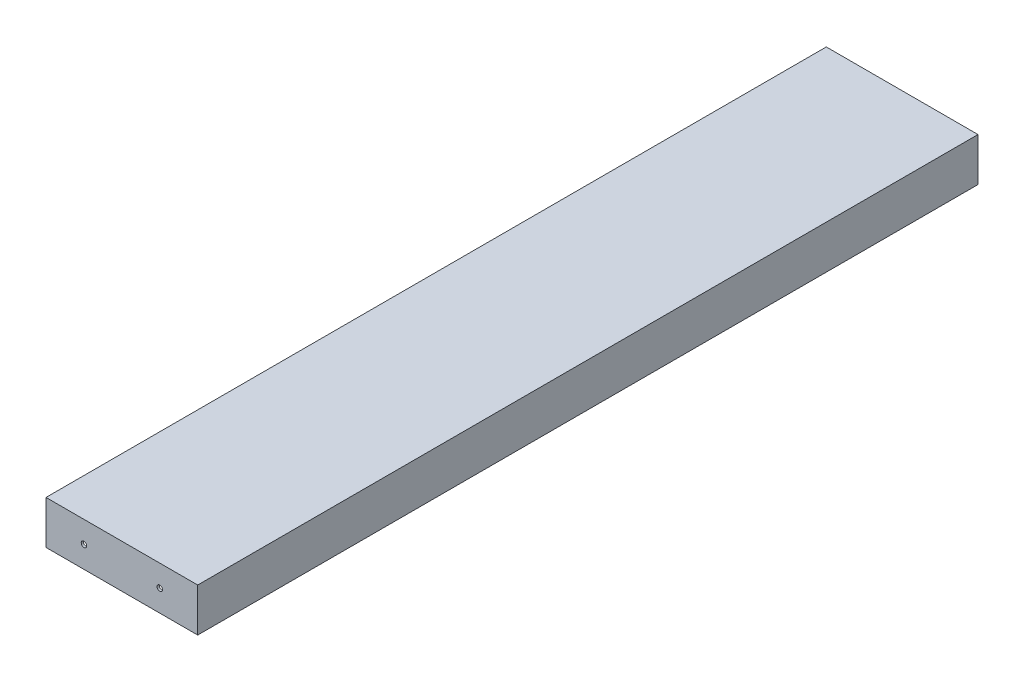
ISO-10303-21;
HEADER;
FILE_DESCRIPTION(('STEP AP214'),'2;1');
FILE_NAME('part.step','',(''),(''),'','','');
FILE_SCHEMA(('AUTOMOTIVE_DESIGN { 1 0 10303 214 1 1 1 1 }'));
ENDSEC;
DATA;
#1=APPLICATION_CONTEXT('core data for automotive mechanical design processes');
#2=APPLICATION_PROTOCOL_DEFINITION('international standard','automotive_design',2000,#1);
#3=PRODUCT_CONTEXT('',#1,'mechanical');
#4=PRODUCT('Part','Part','',(#3));
#5=PRODUCT_RELATED_PRODUCT_CATEGORY('part','',(#4));
#6=PRODUCT_DEFINITION_FORMATION('','',#4);
#7=PRODUCT_DEFINITION_CONTEXT('part definition',#1,'design');
#8=PRODUCT_DEFINITION('design','',#6,#7);
#9=PRODUCT_DEFINITION_SHAPE('','',#8);
#10=(LENGTH_UNIT() NAMED_UNIT(*) SI_UNIT(.MILLI.,.METRE.));
#11=(NAMED_UNIT(*) PLANE_ANGLE_UNIT() SI_UNIT($,.RADIAN.));
#12=(NAMED_UNIT(*) SI_UNIT($,.STERADIAN.) SOLID_ANGLE_UNIT());
#13=UNCERTAINTY_MEASURE_WITH_UNIT(LENGTH_MEASURE(1.E-05),#10,'distance_accuracy_value','');
#14=(GEOMETRIC_REPRESENTATION_CONTEXT(3) GLOBAL_UNCERTAINTY_ASSIGNED_CONTEXT((#13)) GLOBAL_UNIT_ASSIGNED_CONTEXT((#10,
#11,#12)) REPRESENTATION_CONTEXT('',''));
#15=CARTESIAN_POINT('',(0.,0.,0.));
#16=DIRECTION('',(0.,0.,1.));
#17=DIRECTION('',(1.,0.,0.));
#18=AXIS2_PLACEMENT_3D('',#15,#16,#17);
#19=CARTESIAN_POINT('',(0.,0.,914.4));
#20=DIRECTION('',(0.,0.,-1.));
#21=DIRECTION('',(-1.,0.,0.));
#22=AXIS2_PLACEMENT_3D('',#19,#20,#21);
#23=PLANE('',#22);
#24=CARTESIAN_POINT('',(133.35,25.4,914.4));
#25=DIRECTION('',(0.,0.,-1.));
#26=DIRECTION('',(-1.,0.,0.));
#27=AXIS2_PLACEMENT_3D('',#24,#25,#26);
#28=CIRCLE('',#27,3.175);
#29=CARTESIAN_POINT('',(130.175,25.4,914.4));
#30=VERTEX_POINT('',#29);
#31=EDGE_CURVE('E220',#30,#30,#28,.T.);
#32=ORIENTED_EDGE('',*,*,#31,.T.);
#33=EDGE_LOOP('',(#32));
#34=FACE_BOUND('',#33,.T.);
#35=DIRECTION('',(0.,-1.,0.));
#36=VECTOR('',#35,1.);
#37=CARTESIAN_POINT('',(0.,0.,914.4));
#38=LINE('',#37,#36);
#39=CARTESIAN_POINT('',(0.,50.8,914.4));
#40=VERTEX_POINT('',#39);
#41=CARTESIAN_POINT('',(0.,0.,914.4));
#42=VERTEX_POINT('',#41);
#43=EDGE_CURVE('E181',#40,#42,#38,.T.);
#44=ORIENTED_EDGE('',*,*,#43,.T.);
#45=DIRECTION('',(1.,0.,0.));
#46=VECTOR('',#45,1.);
#47=CARTESIAN_POINT('',(0.,0.,914.4));
#48=LINE('',#47,#46);
#49=CARTESIAN_POINT('',(177.8,0.,914.4));
#50=VERTEX_POINT('',#49);
#51=EDGE_CURVE('E100',#42,#50,#48,.T.);
#52=ORIENTED_EDGE('',*,*,#51,.T.);
#53=DIRECTION('',(0.,1.,0.));
#54=VECTOR('',#53,1.);
#55=CARTESIAN_POINT('',(177.8,0.,914.4));
#56=LINE('',#55,#54);
#57=CARTESIAN_POINT('',(177.8,50.8,914.4));
#58=VERTEX_POINT('',#57);
#59=EDGE_CURVE('E186',#50,#58,#56,.T.);
#60=ORIENTED_EDGE('',*,*,#59,.T.);
#61=DIRECTION('',(-1.,0.,0.));
#62=VECTOR('',#61,1.);
#63=CARTESIAN_POINT('',(0.,50.8,914.4));
#64=LINE('',#63,#62);
#65=EDGE_CURVE('E72',#58,#40,#64,.T.);
#66=ORIENTED_EDGE('',*,*,#65,.T.);
#67=EDGE_LOOP('',(#44,#52,#60,#66));
#68=FACE_BOUND('',#67,.T.);
#69=CARTESIAN_POINT('',(44.45,25.4,914.4));
#70=DIRECTION('',(0.,0.,-1.));
#71=DIRECTION('',(-1.,0.,0.));
#72=AXIS2_PLACEMENT_3D('',#69,#70,#71);
#73=CIRCLE('',#72,3.175);
#74=CARTESIAN_POINT('',(41.275,25.4,914.4));
#75=VERTEX_POINT('',#74);
#76=EDGE_CURVE('E149',#75,#75,#73,.F.);
#77=ORIENTED_EDGE('',*,*,#76,.F.);
#78=EDGE_LOOP('',(#77));
#79=FACE_BOUND('',#78,.T.);
#80=ADVANCED_FACE('F45',(#34,#68,#79),#23,.F.);
#81=CARTESIAN_POINT('',(0.,0.,0.));
#82=DIRECTION('',(0.,0.,-1.));
#83=DIRECTION('',(-1.,0.,0.));
#84=AXIS2_PLACEMENT_3D('',#81,#82,#83);
#85=PLANE('',#84);
#86=DIRECTION('',(0.,-1.,0.));
#87=VECTOR('',#86,1.);
#88=CARTESIAN_POINT('',(0.,0.,0.));
#89=LINE('',#88,#87);
#90=CARTESIAN_POINT('',(0.,50.8,0.));
#91=VERTEX_POINT('',#90);
#92=CARTESIAN_POINT('',(0.,0.,0.));
#93=VERTEX_POINT('',#92);
#94=EDGE_CURVE('E173',#91,#93,#89,.T.);
#95=ORIENTED_EDGE('',*,*,#94,.F.);
#96=DIRECTION('',(-1.,0.,0.));
#97=VECTOR('',#96,1.);
#98=CARTESIAN_POINT('',(0.,50.8,0.));
#99=LINE('',#98,#97);
#100=CARTESIAN_POINT('',(177.8,50.8,0.));
#101=VERTEX_POINT('',#100);
#102=EDGE_CURVE('E93',#101,#91,#99,.T.);
#103=ORIENTED_EDGE('',*,*,#102,.F.);
#104=DIRECTION('',(0.,1.,0.));
#105=VECTOR('',#104,1.);
#106=CARTESIAN_POINT('',(177.8,0.,0.));
#107=LINE('',#106,#105);
#108=CARTESIAN_POINT('',(177.8,0.,0.));
#109=VERTEX_POINT('',#108);
#110=EDGE_CURVE('E198',#109,#101,#107,.T.);
#111=ORIENTED_EDGE('',*,*,#110,.F.);
#112=DIRECTION('',(1.,0.,0.));
#113=VECTOR('',#112,1.);
#114=CARTESIAN_POINT('',(0.,0.,0.));
#115=LINE('',#114,#113);
#116=EDGE_CURVE('E195',#93,#109,#115,.T.);
#117=ORIENTED_EDGE('',*,*,#116,.F.);
#118=EDGE_LOOP('',(#95,#103,#111,#117));
#119=FACE_BOUND('',#118,.T.);
#120=CARTESIAN_POINT('',(133.35,25.4,0.));
#121=DIRECTION('',(0.,0.,-1.));
#122=DIRECTION('',(-1.,0.,0.));
#123=AXIS2_PLACEMENT_3D('',#120,#121,#122);
#124=CIRCLE('',#123,3.175);
#125=CARTESIAN_POINT('',(130.175,25.4,0.));
#126=VERTEX_POINT('',#125);
#127=EDGE_CURVE('E223',#126,#126,#124,.T.);
#128=ORIENTED_EDGE('',*,*,#127,.F.);
#129=EDGE_LOOP('',(#128));
#130=FACE_BOUND('',#129,.T.);
#131=CARTESIAN_POINT('',(44.45,25.4,0.));
#132=DIRECTION('',(0.,0.,-1.));
#133=DIRECTION('',(-1.,0.,0.));
#134=AXIS2_PLACEMENT_3D('',#131,#132,#133);
#135=CIRCLE('',#134,3.175);
#136=CARTESIAN_POINT('',(41.275,25.4,0.));
#137=VERTEX_POINT('',#136);
#138=EDGE_CURVE('E214',#137,#137,#135,.F.);
#139=ORIENTED_EDGE('',*,*,#138,.T.);
#140=EDGE_LOOP('',(#139));
#141=FACE_BOUND('',#140,.T.);
#142=ADVANCED_FACE('F251',(#119,#130,#141),#85,.T.);
#143=CARTESIAN_POINT('',(0.,0.,911.86));
#144=DIRECTION('',(0.,0.,-1.));
#145=DIRECTION('',(-1.,0.,0.));
#146=AXIS2_PLACEMENT_3D('',#143,#144,#145);
#147=PLANE('',#146);
#148=DIRECTION('',(0.,-1.,0.));
#149=VECTOR('',#148,1.);
#150=CARTESIAN_POINT('',(2.54,0.,911.86));
#151=LINE('',#150,#149);
#152=CARTESIAN_POINT('',(2.54,48.26,911.86));
#153=VERTEX_POINT('',#152);
#154=CARTESIAN_POINT('',(2.54,0.,911.86));
#155=VERTEX_POINT('',#154);
#156=EDGE_CURVE('E63',#153,#155,#151,.T.);
#157=ORIENTED_EDGE('',*,*,#156,.F.);
#158=DIRECTION('',(-1.,0.,0.));
#159=VECTOR('',#158,1.);
#160=CARTESIAN_POINT('',(0.,48.26,911.86));
#161=LINE('',#160,#159);
#162=CARTESIAN_POINT('',(175.26,48.26,911.86));
#163=VERTEX_POINT('',#162);
#164=EDGE_CURVE('E140',#163,#153,#161,.T.);
#165=ORIENTED_EDGE('',*,*,#164,.F.);
#166=DIRECTION('',(0.,1.,0.));
#167=VECTOR('',#166,1.);
#168=CARTESIAN_POINT('',(175.26,0.,911.86));
#169=LINE('',#168,#167);
#170=CARTESIAN_POINT('',(175.26,0.,911.86));
#171=VERTEX_POINT('',#170);
#172=EDGE_CURVE('E164',#171,#163,#169,.T.);
#173=ORIENTED_EDGE('',*,*,#172,.F.);
#174=DIRECTION('',(1.,0.,0.));
#175=VECTOR('',#174,1.);
#176=CARTESIAN_POINT('',(0.,0.,911.86));
#177=LINE('',#176,#175);
#178=EDGE_CURVE('E160',#155,#171,#177,.T.);
#179=ORIENTED_EDGE('',*,*,#178,.F.);
#180=EDGE_LOOP('',(#157,#165,#173,#179));
#181=FACE_BOUND('',#180,.T.);
#182=CARTESIAN_POINT('',(133.35,25.4,911.86));
#183=DIRECTION('',(0.,0.,-1.));
#184=DIRECTION('',(-1.,0.,0.));
#185=AXIS2_PLACEMENT_3D('',#182,#183,#184);
#186=CIRCLE('',#185,3.175);
#187=CARTESIAN_POINT('',(130.175,25.4,911.86));
#188=VERTEX_POINT('',#187);
#189=EDGE_CURVE('E213',#188,#188,#186,.T.);
#190=ORIENTED_EDGE('',*,*,#189,.F.);
#191=EDGE_LOOP('',(#190));
#192=FACE_BOUND('',#191,.T.);
#193=CARTESIAN_POINT('',(44.45,25.4,911.86));
#194=DIRECTION('',(0.,0.,-1.));
#195=DIRECTION('',(-1.,0.,0.));
#196=AXIS2_PLACEMENT_3D('',#193,#194,#195);
#197=CIRCLE('',#196,3.175);
#198=CARTESIAN_POINT('',(41.275,25.4,911.86));
#199=VERTEX_POINT('',#198);
#200=EDGE_CURVE('E155',#199,#199,#197,.F.);
#201=ORIENTED_EDGE('',*,*,#200,.T.);
#202=EDGE_LOOP('',(#201));
#203=FACE_BOUND('',#202,.T.);
#204=ADVANCED_FACE('F244',(#181,#192,#203),#147,.T.);
#205=CARTESIAN_POINT('',(0.,0.,2.54));
#206=DIRECTION('',(0.,0.,-1.));
#207=DIRECTION('',(-1.,0.,0.));
#208=AXIS2_PLACEMENT_3D('',#205,#206,#207);
#209=PLANE('',#208);
#210=CARTESIAN_POINT('',(133.35,25.4,2.53999999999999));
#211=DIRECTION('',(0.,0.,-1.));
#212=DIRECTION('',(-1.,0.,0.));
#213=AXIS2_PLACEMENT_3D('',#210,#211,#212);
#214=CIRCLE('',#213,3.175);
#215=CARTESIAN_POINT('',(130.175,25.4,2.53999999999999));
#216=VERTEX_POINT('',#215);
#217=EDGE_CURVE('E210',#216,#216,#214,.T.);
#218=ORIENTED_EDGE('',*,*,#217,.T.);
#219=EDGE_LOOP('',(#218));
#220=FACE_BOUND('',#219,.T.);
#221=DIRECTION('',(0.,-1.,0.));
#222=VECTOR('',#221,1.);
#223=CARTESIAN_POINT('',(2.54,0.,2.54));
#224=LINE('',#223,#222);
#225=CARTESIAN_POINT('',(2.54,48.26,2.54));
#226=VERTEX_POINT('',#225);
#227=CARTESIAN_POINT('',(2.54,0.,2.54));
#228=VERTEX_POINT('',#227);
#229=EDGE_CURVE('E128',#226,#228,#224,.T.);
#230=ORIENTED_EDGE('',*,*,#229,.T.);
#231=DIRECTION('',(1.,0.,0.));
#232=VECTOR('',#231,1.);
#233=CARTESIAN_POINT('',(0.,0.,2.54));
#234=LINE('',#233,#232);
#235=CARTESIAN_POINT('',(175.26,0.,2.54));
#236=VERTEX_POINT('',#235);
#237=EDGE_CURVE('E148',#228,#236,#234,.T.);
#238=ORIENTED_EDGE('',*,*,#237,.T.);
#239=DIRECTION('',(0.,1.,0.));
#240=VECTOR('',#239,1.);
#241=CARTESIAN_POINT('',(175.26,0.,2.54));
#242=LINE('',#241,#240);
#243=CARTESIAN_POINT('',(175.26,48.26,2.54));
#244=VERTEX_POINT('',#243);
#245=EDGE_CURVE('E131',#236,#244,#242,.T.);
#246=ORIENTED_EDGE('',*,*,#245,.T.);
#247=DIRECTION('',(-1.,0.,0.));
#248=VECTOR('',#247,1.);
#249=CARTESIAN_POINT('',(0.,48.26,2.54));
#250=LINE('',#249,#248);
#251=EDGE_CURVE('E123',#244,#226,#250,.T.);
#252=ORIENTED_EDGE('',*,*,#251,.T.);
#253=EDGE_LOOP('',(#230,#238,#246,#252));
#254=FACE_BOUND('',#253,.T.);
#255=CARTESIAN_POINT('',(44.45,25.4,2.53999999999999));
#256=DIRECTION('',(0.,0.,-1.));
#257=DIRECTION('',(-1.,0.,0.));
#258=AXIS2_PLACEMENT_3D('',#255,#256,#257);
#259=CIRCLE('',#258,3.175);
#260=CARTESIAN_POINT('',(41.275,25.4,2.53999999999999));
#261=VERTEX_POINT('',#260);
#262=EDGE_CURVE('E49',#261,#261,#259,.F.);
#263=ORIENTED_EDGE('',*,*,#262,.F.);
#264=EDGE_LOOP('',(#263));
#265=FACE_BOUND('',#264,.T.);
#266=ADVANCED_FACE('F125',(#220,#254,#265),#209,.F.);
#267=CARTESIAN_POINT('',(0.,0.,914.4));
#268=DIRECTION('',(0.,1.,0.));
#269=DIRECTION('',(0.,0.,1.));
#270=AXIS2_PLACEMENT_3D('',#267,#268,#269);
#271=PLANE('',#270);
#272=ORIENTED_EDGE('',*,*,#116,.T.);
#273=DIRECTION('',(0.,0.,-1.));
#274=VECTOR('',#273,1.);
#275=CARTESIAN_POINT('',(177.8,0.,914.4));
#276=LINE('',#275,#274);
#277=EDGE_CURVE('E55',#50,#109,#276,.T.);
#278=ORIENTED_EDGE('',*,*,#277,.F.);
#279=ORIENTED_EDGE('',*,*,#51,.F.);
#280=DIRECTION('',(0.,0.,-1.));
#281=VECTOR('',#280,1.);
#282=CARTESIAN_POINT('',(0.,0.,914.4));
#283=LINE('',#282,#281);
#284=EDGE_CURVE('E11',#42,#93,#283,.T.);
#285=ORIENTED_EDGE('',*,*,#284,.T.);
#286=EDGE_LOOP('',(#272,#278,#279,#285));
#287=FACE_BOUND('',#286,.T.);
#288=ORIENTED_EDGE('',*,*,#237,.F.);
#289=DIRECTION('',(0.,0.,-1.));
#290=VECTOR('',#289,1.);
#291=CARTESIAN_POINT('',(2.54,0.,914.4));
#292=LINE('',#291,#290);
#293=EDGE_CURVE('E146',#155,#228,#292,.T.);
#294=ORIENTED_EDGE('',*,*,#293,.F.);
#295=ORIENTED_EDGE('',*,*,#178,.T.);
#296=DIRECTION('',(0.,0.,-1.));
#297=VECTOR('',#296,1.);
#298=CARTESIAN_POINT('',(175.26,0.,914.4));
#299=LINE('',#298,#297);
#300=EDGE_CURVE('E167',#171,#236,#299,.T.);
#301=ORIENTED_EDGE('',*,*,#300,.T.);
#302=EDGE_LOOP('',(#288,#294,#295,#301));
#303=FACE_BOUND('',#302,.T.);
#304=ADVANCED_FACE('F243',(#287,#303),#271,.F.);
#305=CARTESIAN_POINT('',(0.,0.,914.4));
#306=DIRECTION('',(1.,0.,0.));
#307=DIRECTION('',(0.,0.,-1.));
#308=AXIS2_PLACEMENT_3D('',#305,#306,#307);
#309=PLANE('',#308);
#310=ORIENTED_EDGE('',*,*,#94,.T.);
#311=ORIENTED_EDGE('',*,*,#284,.F.);
#312=ORIENTED_EDGE('',*,*,#43,.F.);
#313=DIRECTION('',(0.,0.,-1.));
#314=VECTOR('',#313,1.);
#315=CARTESIAN_POINT('',(0.,50.8,914.4));
#316=LINE('',#315,#314);
#317=EDGE_CURVE('E191',#40,#91,#316,.T.);
#318=ORIENTED_EDGE('',*,*,#317,.T.);
#319=EDGE_LOOP('',(#310,#311,#312,#318));
#320=FACE_BOUND('',#319,.T.);
#321=ADVANCED_FACE('F47',(#320),#309,.F.);
#322=CARTESIAN_POINT('',(177.8,0.,914.4));
#323=DIRECTION('',(-1.,0.,0.));
#324=DIRECTION('',(0.,0.,1.));
#325=AXIS2_PLACEMENT_3D('',#322,#323,#324);
#326=PLANE('',#325);
#327=ORIENTED_EDGE('',*,*,#110,.T.);
#328=DIRECTION('',(0.,0.,-1.));
#329=VECTOR('',#328,1.);
#330=CARTESIAN_POINT('',(177.8,50.8,914.4));
#331=LINE('',#330,#329);
#332=EDGE_CURVE('E205',#58,#101,#331,.T.);
#333=ORIENTED_EDGE('',*,*,#332,.F.);
#334=ORIENTED_EDGE('',*,*,#59,.F.);
#335=ORIENTED_EDGE('',*,*,#277,.T.);
#336=EDGE_LOOP('',(#327,#333,#334,#335));
#337=FACE_BOUND('',#336,.T.);
#338=ADVANCED_FACE('F267',(#337),#326,.F.);
#339=CARTESIAN_POINT('',(0.,50.8,914.4));
#340=DIRECTION('',(0.,-1.,0.));
#341=DIRECTION('',(0.,0.,-1.));
#342=AXIS2_PLACEMENT_3D('',#339,#340,#341);
#343=PLANE('',#342);
#344=ORIENTED_EDGE('',*,*,#102,.T.);
#345=ORIENTED_EDGE('',*,*,#317,.F.);
#346=ORIENTED_EDGE('',*,*,#65,.F.);
#347=ORIENTED_EDGE('',*,*,#332,.T.);
#348=EDGE_LOOP('',(#344,#345,#346,#347));
#349=FACE_BOUND('',#348,.T.);
#350=ADVANCED_FACE('F264',(#349),#343,.F.);
#351=CARTESIAN_POINT('',(2.54,0.,914.4));
#352=DIRECTION('',(1.,0.,0.));
#353=DIRECTION('',(0.,0.,-1.));
#354=AXIS2_PLACEMENT_3D('',#351,#352,#353);
#355=PLANE('',#354);
#356=ORIENTED_EDGE('',*,*,#229,.F.);
#357=DIRECTION('',(0.,0.,-1.));
#358=VECTOR('',#357,1.);
#359=CARTESIAN_POINT('',(2.54,48.26,914.4));
#360=LINE('',#359,#358);
#361=EDGE_CURVE('E137',#153,#226,#360,.T.);
#362=ORIENTED_EDGE('',*,*,#361,.F.);
#363=ORIENTED_EDGE('',*,*,#156,.T.);
#364=ORIENTED_EDGE('',*,*,#293,.T.);
#365=EDGE_LOOP('',(#356,#362,#363,#364));
#366=FACE_BOUND('',#365,.T.);
#367=ADVANCED_FACE('F144',(#366),#355,.T.);
#368=CARTESIAN_POINT('',(175.26,0.,914.4));
#369=DIRECTION('',(-1.,0.,0.));
#370=DIRECTION('',(0.,0.,1.));
#371=AXIS2_PLACEMENT_3D('',#368,#369,#370);
#372=PLANE('',#371);
#373=ORIENTED_EDGE('',*,*,#245,.F.);
#374=ORIENTED_EDGE('',*,*,#300,.F.);
#375=ORIENTED_EDGE('',*,*,#172,.T.);
#376=DIRECTION('',(0.,0.,-1.));
#377=VECTOR('',#376,1.);
#378=CARTESIAN_POINT('',(175.26,48.26,914.4));
#379=LINE('',#378,#377);
#380=EDGE_CURVE('E142',#163,#244,#379,.T.);
#381=ORIENTED_EDGE('',*,*,#380,.T.);
#382=EDGE_LOOP('',(#373,#374,#375,#381));
#383=FACE_BOUND('',#382,.T.);
#384=ADVANCED_FACE('F284',(#383),#372,.T.);
#385=CARTESIAN_POINT('',(0.,48.26,914.4));
#386=DIRECTION('',(0.,-1.,0.));
#387=DIRECTION('',(0.,0.,-1.));
#388=AXIS2_PLACEMENT_3D('',#385,#386,#387);
#389=PLANE('',#388);
#390=ORIENTED_EDGE('',*,*,#251,.F.);
#391=ORIENTED_EDGE('',*,*,#380,.F.);
#392=ORIENTED_EDGE('',*,*,#164,.T.);
#393=ORIENTED_EDGE('',*,*,#361,.T.);
#394=EDGE_LOOP('',(#390,#391,#392,#393));
#395=FACE_BOUND('',#394,.T.);
#396=ADVANCED_FACE('F138',(#395),#389,.T.);
#397=CARTESIAN_POINT('',(133.35,25.4,945.134));
#398=DIRECTION('',(0.,0.,-1.));
#399=DIRECTION('',(-1.,0.,0.));
#400=AXIS2_PLACEMENT_3D('',#397,#398,#399);
#401=CYLINDRICAL_SURFACE('',#400,3.175);
#402=CARTESIAN_POINT('',(130.175,25.4,0.));
#403=CARTESIAN_POINT('',(130.175,25.4,0.0264583333333309));
#404=CARTESIAN_POINT('',(130.175,25.4,0.0529166666666618));
#405=CARTESIAN_POINT('',(130.175,25.4,0.105833333333324));
#406=CARTESIAN_POINT('',(130.175,25.4,0.132291666666654));
#407=CARTESIAN_POINT('',(130.175,25.4,0.185208333333316));
#408=CARTESIAN_POINT('',(130.175,25.4,0.211666666666647));
#409=CARTESIAN_POINT('',(130.175,25.4,0.264583333333309));
#410=CARTESIAN_POINT('',(130.175,25.4,0.29104166666664));
#411=CARTESIAN_POINT('',(130.175,25.4,0.343958333333301));
#412=CARTESIAN_POINT('',(130.175,25.4,0.370416666666632));
#413=CARTESIAN_POINT('',(130.175,25.4,0.423333333333294));
#414=CARTESIAN_POINT('',(130.175,25.4,0.449791666666625));
#415=CARTESIAN_POINT('',(130.175,25.4,0.502708333333287));
#416=CARTESIAN_POINT('',(130.175,25.4,0.529166666666618));
#417=CARTESIAN_POINT('',(130.175,25.4,0.582083333333279));
#418=CARTESIAN_POINT('',(130.175,25.4,0.60854166666661));
#419=CARTESIAN_POINT('',(130.175,25.4,0.661458333333309));
#420=CARTESIAN_POINT('',(130.175,25.4,0.687916666666677));
#421=CARTESIAN_POINT('',(130.175,25.4,0.740833333333376));
#422=CARTESIAN_POINT('',(130.175,25.4,0.767291666666707));
#423=CARTESIAN_POINT('',(130.175,25.4,0.820208333333368));
#424=CARTESIAN_POINT('',(130.175,25.4,0.846666666666699));
#425=CARTESIAN_POINT('',(130.175,25.4,0.899583333333361));
#426=CARTESIAN_POINT('',(130.175,25.4,0.926041666666692));
#427=CARTESIAN_POINT('',(130.175,25.4,0.978958333333354));
#428=CARTESIAN_POINT('',(130.175,25.4,1.00541666666668));
#429=CARTESIAN_POINT('',(130.175,25.4,1.05833333333335));
#430=CARTESIAN_POINT('',(130.175,25.4,1.08479166666668));
#431=CARTESIAN_POINT('',(130.175,25.4,1.13770833333334));
#432=CARTESIAN_POINT('',(130.175,25.4,1.16416666666667));
#433=CARTESIAN_POINT('',(130.175,25.4,1.21708333333333));
#434=CARTESIAN_POINT('',(130.175,25.4,1.24354166666666));
#435=CARTESIAN_POINT('',(130.175,25.4,1.29645833333332));
#436=CARTESIAN_POINT('',(130.175,25.4,1.32291666666666));
#437=CARTESIAN_POINT('',(130.175,25.4,1.37583333333332));
#438=CARTESIAN_POINT('',(130.175,25.4,1.40229166666665));
#439=CARTESIAN_POINT('',(130.175,25.4,1.45520833333331));
#440=CARTESIAN_POINT('',(130.175,25.4,1.48166666666664));
#441=CARTESIAN_POINT('',(130.175,25.4,1.5345833333333));
#442=CARTESIAN_POINT('',(130.175,25.4,1.56104166666663));
#443=CARTESIAN_POINT('',(130.175,25.4,1.61395833333329));
#444=CARTESIAN_POINT('',(130.175,25.4,1.64041666666663));
#445=CARTESIAN_POINT('',(130.175,25.4,1.69333333333329));
#446=CARTESIAN_POINT('',(130.175,25.4,1.71979166666662));
#447=CARTESIAN_POINT('',(130.175,25.4,1.77270833333328));
#448=CARTESIAN_POINT('',(130.175,25.4,1.79916666666661));
#449=CARTESIAN_POINT('',(130.175,25.4,1.85208333333331));
#450=CARTESIAN_POINT('',(130.175,25.4,1.87854166666668));
#451=CARTESIAN_POINT('',(130.175,25.4,1.93145833333338));
#452=CARTESIAN_POINT('',(130.175,25.4,1.95791666666671));
#453=CARTESIAN_POINT('',(130.175,25.4,2.01083333333337));
#454=CARTESIAN_POINT('',(130.175,25.4,2.0372916666667));
#455=CARTESIAN_POINT('',(130.175,25.4,2.09020833333336));
#456=CARTESIAN_POINT('',(130.175,25.4,2.11666666666669));
#457=CARTESIAN_POINT('',(130.175,25.4,2.16958333333335));
#458=CARTESIAN_POINT('',(130.175,25.4,2.19604166666669));
#459=CARTESIAN_POINT('',(130.175,25.4,2.24895833333335));
#460=CARTESIAN_POINT('',(130.175,25.4,2.27541666666668));
#461=CARTESIAN_POINT('',(130.175,25.4,2.32833333333334));
#462=CARTESIAN_POINT('',(130.175,25.4,2.35479166666667));
#463=CARTESIAN_POINT('',(130.175,25.4,2.40770833333333));
#464=CARTESIAN_POINT('',(130.175,25.4,2.43416666666666));
#465=CARTESIAN_POINT('',(130.175,25.4,2.48708333333333));
#466=CARTESIAN_POINT('',(130.175,25.4,2.51354166666666));
#467=CARTESIAN_POINT('',(130.175,25.4,2.53999999999999));
#468=B_SPLINE_CURVE_WITH_KNOTS('',3,(#402,#403,#404,#405,#406,#407,#408,#409,#410,#411,#412,
#413,#414,#415,#416,#417,#418,#419,#420,#421,#422,#423,#424,#425,#426,#427,#428,#429,#430,#431,
#432,#433,#434,#435,#436,#437,#438,#439,#440,#441,#442,#443,#444,#445,#446,#447,#448,#449,#450,
#451,#452,#453,#454,#455,#456,#457,#458,#459,#460,#461,#462,#463,#464,#465,#466,#467),
.UNSPECIFIED.,.F.,.F.,(4,2,2,2,2,2,2,2,2,2,2,2,2,2,2,2,2,2,2,2,2,2,2,2,2,2,2,2,2,2,2,2,4),(0.,
0.0793749999999926,0.158749999999985,0.238124999999978,0.317499999999971,0.396874999999963,
0.476249999999956,0.555624999999949,0.634999999999941,0.714375000000045,0.793750000000037,
0.87312500000003,0.952500000000023,1.03187500000002,1.11125000000001,1.190625,1.26999999999999,
1.34937499999999,1.42874999999998,1.50812499999997,1.58749999999996,1.66687499999996,
1.74624999999995,1.82562499999994,1.90500000000005,1.98437500000004,2.06375000000003,
2.14312500000002,2.22250000000002,2.30187500000001,2.38125,2.46062499999999,2.53999999999999),.UNSPECIFIED.);
#469=EDGE_CURVE('BSEAM294',#126,#216,#468,.T.);
#470=ORIENTED_EDGE('',*,*,#127,.T.);
#471=ORIENTED_EDGE('',*,*,#217,.F.);
#472=ORIENTED_EDGE('',*,*,#469,.T.);
#473=ORIENTED_EDGE('',*,*,#469,.F.);
#474=EDGE_LOOP('',(#470,#472,#471,#473));
#475=FACE_BOUND('',#474,.T.);
#476=ADVANCED_FACE('F294',(#475),#401,.F.);
#477=CARTESIAN_POINT('',(44.45,25.4,945.134));
#478=DIRECTION('',(0.,0.,-1.));
#479=DIRECTION('',(-1.,0.,0.));
#480=AXIS2_PLACEMENT_3D('',#477,#478,#479);
#481=CYLINDRICAL_SURFACE('',#480,3.175);
#482=CARTESIAN_POINT('',(41.275,25.4,0.));
#483=CARTESIAN_POINT('',(41.275,25.4,0.0264583333333309));
#484=CARTESIAN_POINT('',(41.275,25.4,0.0529166666666618));
#485=CARTESIAN_POINT('',(41.275,25.4,0.105833333333324));
#486=CARTESIAN_POINT('',(41.275,25.4,0.132291666666654));
#487=CARTESIAN_POINT('',(41.275,25.4,0.185208333333316));
#488=CARTESIAN_POINT('',(41.275,25.4,0.211666666666647));
#489=CARTESIAN_POINT('',(41.275,25.4,0.264583333333309));
#490=CARTESIAN_POINT('',(41.275,25.4,0.29104166666664));
#491=CARTESIAN_POINT('',(41.275,25.4,0.343958333333301));
#492=CARTESIAN_POINT('',(41.275,25.4,0.370416666666632));
#493=CARTESIAN_POINT('',(41.275,25.4,0.423333333333294));
#494=CARTESIAN_POINT('',(41.275,25.4,0.449791666666625));
#495=CARTESIAN_POINT('',(41.275,25.4,0.502708333333287));
#496=CARTESIAN_POINT('',(41.275,25.4,0.529166666666618));
#497=CARTESIAN_POINT('',(41.275,25.4,0.582083333333279));
#498=CARTESIAN_POINT('',(41.275,25.4,0.60854166666661));
#499=CARTESIAN_POINT('',(41.275,25.4,0.661458333333309));
#500=CARTESIAN_POINT('',(41.275,25.4,0.687916666666677));
#501=CARTESIAN_POINT('',(41.275,25.4,0.740833333333376));
#502=CARTESIAN_POINT('',(41.275,25.4,0.767291666666707));
#503=CARTESIAN_POINT('',(41.275,25.4,0.820208333333368));
#504=CARTESIAN_POINT('',(41.275,25.4,0.846666666666699));
#505=CARTESIAN_POINT('',(41.275,25.4,0.899583333333361));
#506=CARTESIAN_POINT('',(41.275,25.4,0.926041666666692));
#507=CARTESIAN_POINT('',(41.275,25.4,0.978958333333354));
#508=CARTESIAN_POINT('',(41.275,25.4,1.00541666666668));
#509=CARTESIAN_POINT('',(41.275,25.4,1.05833333333335));
#510=CARTESIAN_POINT('',(41.275,25.4,1.08479166666668));
#511=CARTESIAN_POINT('',(41.275,25.4,1.13770833333334));
#512=CARTESIAN_POINT('',(41.275,25.4,1.16416666666667));
#513=CARTESIAN_POINT('',(41.275,25.4,1.21708333333333));
#514=CARTESIAN_POINT('',(41.275,25.4,1.24354166666666));
#515=CARTESIAN_POINT('',(41.275,25.4,1.29645833333332));
#516=CARTESIAN_POINT('',(41.275,25.4,1.32291666666666));
#517=CARTESIAN_POINT('',(41.275,25.4,1.37583333333332));
#518=CARTESIAN_POINT('',(41.275,25.4,1.40229166666665));
#519=CARTESIAN_POINT('',(41.275,25.4,1.45520833333331));
#520=CARTESIAN_POINT('',(41.275,25.4,1.48166666666664));
#521=CARTESIAN_POINT('',(41.275,25.4,1.5345833333333));
#522=CARTESIAN_POINT('',(41.275,25.4,1.56104166666663));
#523=CARTESIAN_POINT('',(41.275,25.4,1.61395833333329));
#524=CARTESIAN_POINT('',(41.275,25.4,1.64041666666663));
#525=CARTESIAN_POINT('',(41.275,25.4,1.69333333333329));
#526=CARTESIAN_POINT('',(41.275,25.4,1.71979166666662));
#527=CARTESIAN_POINT('',(41.275,25.4,1.77270833333328));
#528=CARTESIAN_POINT('',(41.275,25.4,1.79916666666661));
#529=CARTESIAN_POINT('',(41.275,25.4,1.85208333333331));
#530=CARTESIAN_POINT('',(41.275,25.4,1.87854166666668));
#531=CARTESIAN_POINT('',(41.275,25.4,1.93145833333338));
#532=CARTESIAN_POINT('',(41.275,25.4,1.95791666666671));
#533=CARTESIAN_POINT('',(41.275,25.4,2.01083333333337));
#534=CARTESIAN_POINT('',(41.275,25.4,2.0372916666667));
#535=CARTESIAN_POINT('',(41.275,25.4,2.09020833333336));
#536=CARTESIAN_POINT('',(41.275,25.4,2.11666666666669));
#537=CARTESIAN_POINT('',(41.275,25.4,2.16958333333335));
#538=CARTESIAN_POINT('',(41.275,25.4,2.19604166666669));
#539=CARTESIAN_POINT('',(41.275,25.4,2.24895833333335));
#540=CARTESIAN_POINT('',(41.275,25.4,2.27541666666668));
#541=CARTESIAN_POINT('',(41.275,25.4,2.32833333333334));
#542=CARTESIAN_POINT('',(41.275,25.4,2.35479166666667));
#543=CARTESIAN_POINT('',(41.275,25.4,2.40770833333333));
#544=CARTESIAN_POINT('',(41.275,25.4,2.43416666666666));
#545=CARTESIAN_POINT('',(41.275,25.4,2.48708333333333));
#546=CARTESIAN_POINT('',(41.275,25.4,2.51354166666666));
#547=CARTESIAN_POINT('',(41.275,25.4,2.53999999999999));
#548=B_SPLINE_CURVE_WITH_KNOTS('',3,(#482,#483,#484,#485,#486,#487,#488,#489,#490,#491,#492,
#493,#494,#495,#496,#497,#498,#499,#500,#501,#502,#503,#504,#505,#506,#507,#508,#509,#510,#511,
#512,#513,#514,#515,#516,#517,#518,#519,#520,#521,#522,#523,#524,#525,#526,#527,#528,#529,#530,
#531,#532,#533,#534,#535,#536,#537,#538,#539,#540,#541,#542,#543,#544,#545,#546,#547),
.UNSPECIFIED.,.F.,.F.,(4,2,2,2,2,2,2,2,2,2,2,2,2,2,2,2,2,2,2,2,2,2,2,2,2,2,2,2,2,2,2,2,4),(0.,
0.0793749999999926,0.158749999999985,0.238124999999978,0.317499999999971,0.396874999999963,
0.476249999999956,0.555624999999949,0.634999999999941,0.714375000000045,0.793750000000037,
0.87312500000003,0.952500000000023,1.03187500000002,1.11125000000001,1.190625,1.26999999999999,
1.34937499999999,1.42874999999998,1.50812499999997,1.58749999999996,1.66687499999996,
1.74624999999995,1.82562499999994,1.90500000000005,1.98437500000004,2.06375000000003,
2.14312500000002,2.22250000000002,2.30187500000001,2.38125,2.46062499999999,2.53999999999999),.UNSPECIFIED.);
#549=EDGE_CURVE('BSEAM241',#137,#261,#548,.T.);
#550=ORIENTED_EDGE('',*,*,#138,.F.);
#551=ORIENTED_EDGE('',*,*,#262,.T.);
#552=ORIENTED_EDGE('',*,*,#549,.T.);
#553=ORIENTED_EDGE('',*,*,#549,.F.);
#554=EDGE_LOOP('',(#550,#552,#551,#553));
#555=FACE_BOUND('',#554,.T.);
#556=ADVANCED_FACE('F241',(#555),#481,.F.);
#557=CARTESIAN_POINT('',(130.175,25.4,911.86));
#558=CARTESIAN_POINT('',(130.175,25.4,911.886458333333));
#559=CARTESIAN_POINT('',(130.175,25.4,911.912916666667));
#560=CARTESIAN_POINT('',(130.175,25.4,911.965833333333));
#561=CARTESIAN_POINT('',(130.175,25.4,911.992291666667));
#562=CARTESIAN_POINT('',(130.175,25.4,912.045208333333));
#563=CARTESIAN_POINT('',(130.175,25.4,912.071666666667));
#564=CARTESIAN_POINT('',(130.175,25.4,912.124583333333));
#565=CARTESIAN_POINT('',(130.175,25.4,912.151041666667));
#566=CARTESIAN_POINT('',(130.175,25.4,912.203958333334));
#567=CARTESIAN_POINT('',(130.175,25.4,912.230416666667));
#568=CARTESIAN_POINT('',(130.175,25.4,912.283333333333));
#569=CARTESIAN_POINT('',(130.175,25.4,912.309791666667));
#570=CARTESIAN_POINT('',(130.175,25.4,912.362708333333));
#571=CARTESIAN_POINT('',(130.175,25.4,912.389166666667));
#572=CARTESIAN_POINT('',(130.175,25.4,912.442083333333));
#573=CARTESIAN_POINT('',(130.175,25.4,912.468541666667));
#574=CARTESIAN_POINT('',(130.175,25.4,912.521458333333));
#575=CARTESIAN_POINT('',(130.175,25.4,912.547916666667));
#576=CARTESIAN_POINT('',(130.175,25.4,912.600833333333));
#577=CARTESIAN_POINT('',(130.175,25.4,912.627291666667));
#578=CARTESIAN_POINT('',(130.175,25.4,912.680208333333));
#579=CARTESIAN_POINT('',(130.175,25.4,912.706666666667));
#580=CARTESIAN_POINT('',(130.175,25.4,912.759583333333));
#581=CARTESIAN_POINT('',(130.175,25.4,912.786041666667));
#582=CARTESIAN_POINT('',(130.175,25.4,912.838958333333));
#583=CARTESIAN_POINT('',(130.175,25.4,912.865416666667));
#584=CARTESIAN_POINT('',(130.175,25.4,912.918333333333));
#585=CARTESIAN_POINT('',(130.175,25.4,912.944791666667));
#586=CARTESIAN_POINT('',(130.175,25.4,912.997708333333));
#587=CARTESIAN_POINT('',(130.175,25.4,913.024166666667));
#588=CARTESIAN_POINT('',(130.175,25.4,913.077083333333));
#589=CARTESIAN_POINT('',(130.175,25.4,913.103541666667));
#590=CARTESIAN_POINT('',(130.175,25.4,913.156458333333));
#591=CARTESIAN_POINT('',(130.175,25.4,913.182916666667));
#592=CARTESIAN_POINT('',(130.175,25.4,913.235833333334));
#593=CARTESIAN_POINT('',(130.175,25.4,913.262291666667));
#594=CARTESIAN_POINT('',(130.175,25.4,913.315208333333));
#595=CARTESIAN_POINT('',(130.175,25.4,913.341666666667));
#596=CARTESIAN_POINT('',(130.175,25.4,913.394583333333));
#597=CARTESIAN_POINT('',(130.175,25.4,913.421041666667));
#598=CARTESIAN_POINT('',(130.175,25.4,913.473958333333));
#599=CARTESIAN_POINT('',(130.175,25.4,913.500416666667));
#600=CARTESIAN_POINT('',(130.175,25.4,913.553333333333));
#601=CARTESIAN_POINT('',(130.175,25.4,913.579791666667));
#602=CARTESIAN_POINT('',(130.175,25.4,913.632708333333));
#603=CARTESIAN_POINT('',(130.175,25.4,913.659166666667));
#604=CARTESIAN_POINT('',(130.175,25.4,913.712083333333));
#605=CARTESIAN_POINT('',(130.175,25.4,913.738541666667));
#606=CARTESIAN_POINT('',(130.175,25.4,913.791458333333));
#607=CARTESIAN_POINT('',(130.175,25.4,913.817916666667));
#608=CARTESIAN_POINT('',(130.175,25.4,913.870833333333));
#609=CARTESIAN_POINT('',(130.175,25.4,913.897291666667));
#610=CARTESIAN_POINT('',(130.175,25.4,913.950208333333));
#611=CARTESIAN_POINT('',(130.175,25.4,913.976666666667));
#612=CARTESIAN_POINT('',(130.175,25.4,914.029583333333));
#613=CARTESIAN_POINT('',(130.175,25.4,914.056041666667));
#614=CARTESIAN_POINT('',(130.175,25.4,914.108958333333));
#615=CARTESIAN_POINT('',(130.175,25.4,914.135416666667));
#616=CARTESIAN_POINT('',(130.175,25.4,914.188333333333));
#617=CARTESIAN_POINT('',(130.175,25.4,914.214791666667));
#618=CARTESIAN_POINT('',(130.175,25.4,914.267708333333));
#619=CARTESIAN_POINT('',(130.175,25.4,914.294166666667));
#620=CARTESIAN_POINT('',(130.175,25.4,914.347083333333));
#621=CARTESIAN_POINT('',(130.175,25.4,914.373541666667));
#622=CARTESIAN_POINT('',(130.175,25.4,914.4));
#623=B_SPLINE_CURVE_WITH_KNOTS('',3,(#557,#558,#559,#560,#561,#562,#563,#564,#565,#566,#567,
#568,#569,#570,#571,#572,#573,#574,#575,#576,#577,#578,#579,#580,#581,#582,#583,#584,#585,#586,
#587,#588,#589,#590,#591,#592,#593,#594,#595,#596,#597,#598,#599,#600,#601,#602,#603,#604,#605,
#606,#607,#608,#609,#610,#611,#612,#613,#614,#615,#616,#617,#618,#619,#620,#621,#622),
.UNSPECIFIED.,.F.,.F.,(4,2,2,2,2,2,2,2,2,2,2,2,2,2,2,2,2,2,2,2,2,2,2,2,2,2,2,2,2,2,2,2,4),(0.,
0.0793749999999926,0.158750000000096,0.238125000000089,0.317500000000082,0.396875000000074,
0.476250000000067,0.55562500000006,0.635000000000052,0.714375000000045,0.793750000000037,
0.87312500000003,0.952500000000023,1.03187500000002,1.11125000000001,1.190625,1.26999999999999,
1.3493750000001,1.42875000000009,1.50812500000008,1.58750000000007,1.66687500000007,
1.74625000000006,1.82562500000005,1.90500000000005,1.98437500000004,2.06375000000003,
2.14312500000002,2.22250000000002,2.30187500000001,2.38125,2.46062499999999,2.53999999999999),.UNSPECIFIED.);
#624=EDGE_CURVE('BSEAM289',#188,#30,#623,.T.);
#625=ORIENTED_EDGE('',*,*,#189,.T.);
#626=ORIENTED_EDGE('',*,*,#31,.F.);
#627=ORIENTED_EDGE('',*,*,#624,.T.);
#628=ORIENTED_EDGE('',*,*,#624,.F.);
#629=EDGE_LOOP('',(#625,#627,#626,#628));
#630=FACE_BOUND('',#629,.T.);
#631=ADVANCED_FACE('F289',(#630),#401,.F.);
#632=CARTESIAN_POINT('',(41.275,25.4,911.86));
#633=CARTESIAN_POINT('',(41.275,25.4,911.886458333333));
#634=CARTESIAN_POINT('',(41.275,25.4,911.912916666667));
#635=CARTESIAN_POINT('',(41.275,25.4,911.965833333333));
#636=CARTESIAN_POINT('',(41.275,25.4,911.992291666667));
#637=CARTESIAN_POINT('',(41.275,25.4,912.045208333333));
#638=CARTESIAN_POINT('',(41.275,25.4,912.071666666667));
#639=CARTESIAN_POINT('',(41.275,25.4,912.124583333333));
#640=CARTESIAN_POINT('',(41.275,25.4,912.151041666667));
#641=CARTESIAN_POINT('',(41.275,25.4,912.203958333334));
#642=CARTESIAN_POINT('',(41.275,25.4,912.230416666667));
#643=CARTESIAN_POINT('',(41.275,25.4,912.283333333333));
#644=CARTESIAN_POINT('',(41.275,25.4,912.309791666667));
#645=CARTESIAN_POINT('',(41.275,25.4,912.362708333333));
#646=CARTESIAN_POINT('',(41.275,25.4,912.389166666667));
#647=CARTESIAN_POINT('',(41.275,25.4,912.442083333333));
#648=CARTESIAN_POINT('',(41.275,25.4,912.468541666667));
#649=CARTESIAN_POINT('',(41.275,25.4,912.521458333333));
#650=CARTESIAN_POINT('',(41.275,25.4,912.547916666667));
#651=CARTESIAN_POINT('',(41.275,25.4,912.600833333333));
#652=CARTESIAN_POINT('',(41.275,25.4,912.627291666667));
#653=CARTESIAN_POINT('',(41.275,25.4,912.680208333333));
#654=CARTESIAN_POINT('',(41.275,25.4,912.706666666667));
#655=CARTESIAN_POINT('',(41.275,25.4,912.759583333333));
#656=CARTESIAN_POINT('',(41.275,25.4,912.786041666667));
#657=CARTESIAN_POINT('',(41.275,25.4,912.838958333333));
#658=CARTESIAN_POINT('',(41.275,25.4,912.865416666667));
#659=CARTESIAN_POINT('',(41.275,25.4,912.918333333333));
#660=CARTESIAN_POINT('',(41.275,25.4,912.944791666667));
#661=CARTESIAN_POINT('',(41.275,25.4,912.997708333333));
#662=CARTESIAN_POINT('',(41.275,25.4,913.024166666667));
#663=CARTESIAN_POINT('',(41.275,25.4,913.077083333333));
#664=CARTESIAN_POINT('',(41.275,25.4,913.103541666667));
#665=CARTESIAN_POINT('',(41.275,25.4,913.156458333333));
#666=CARTESIAN_POINT('',(41.275,25.4,913.182916666667));
#667=CARTESIAN_POINT('',(41.275,25.4,913.235833333334));
#668=CARTESIAN_POINT('',(41.275,25.4,913.262291666667));
#669=CARTESIAN_POINT('',(41.275,25.4,913.315208333333));
#670=CARTESIAN_POINT('',(41.275,25.4,913.341666666667));
#671=CARTESIAN_POINT('',(41.275,25.4,913.394583333333));
#672=CARTESIAN_POINT('',(41.275,25.4,913.421041666667));
#673=CARTESIAN_POINT('',(41.275,25.4,913.473958333333));
#674=CARTESIAN_POINT('',(41.275,25.4,913.500416666667));
#675=CARTESIAN_POINT('',(41.275,25.4,913.553333333333));
#676=CARTESIAN_POINT('',(41.275,25.4,913.579791666667));
#677=CARTESIAN_POINT('',(41.275,25.4,913.632708333333));
#678=CARTESIAN_POINT('',(41.275,25.4,913.659166666667));
#679=CARTESIAN_POINT('',(41.275,25.4,913.712083333333));
#680=CARTESIAN_POINT('',(41.275,25.4,913.738541666667));
#681=CARTESIAN_POINT('',(41.275,25.4,913.791458333333));
#682=CARTESIAN_POINT('',(41.275,25.4,913.817916666667));
#683=CARTESIAN_POINT('',(41.275,25.4,913.870833333333));
#684=CARTESIAN_POINT('',(41.275,25.4,913.897291666667));
#685=CARTESIAN_POINT('',(41.275,25.4,913.950208333333));
#686=CARTESIAN_POINT('',(41.275,25.4,913.976666666667));
#687=CARTESIAN_POINT('',(41.275,25.4,914.029583333333));
#688=CARTESIAN_POINT('',(41.275,25.4,914.056041666667));
#689=CARTESIAN_POINT('',(41.275,25.4,914.108958333333));
#690=CARTESIAN_POINT('',(41.275,25.4,914.135416666667));
#691=CARTESIAN_POINT('',(41.275,25.4,914.188333333333));
#692=CARTESIAN_POINT('',(41.275,25.4,914.214791666667));
#693=CARTESIAN_POINT('',(41.275,25.4,914.267708333333));
#694=CARTESIAN_POINT('',(41.275,25.4,914.294166666667));
#695=CARTESIAN_POINT('',(41.275,25.4,914.347083333333));
#696=CARTESIAN_POINT('',(41.275,25.4,914.373541666667));
#697=CARTESIAN_POINT('',(41.275,25.4,914.4));
#698=B_SPLINE_CURVE_WITH_KNOTS('',3,(#632,#633,#634,#635,#636,#637,#638,#639,#640,#641,#642,
#643,#644,#645,#646,#647,#648,#649,#650,#651,#652,#653,#654,#655,#656,#657,#658,#659,#660,#661,
#662,#663,#664,#665,#666,#667,#668,#669,#670,#671,#672,#673,#674,#675,#676,#677,#678,#679,#680,
#681,#682,#683,#684,#685,#686,#687,#688,#689,#690,#691,#692,#693,#694,#695,#696,#697),
.UNSPECIFIED.,.F.,.F.,(4,2,2,2,2,2,2,2,2,2,2,2,2,2,2,2,2,2,2,2,2,2,2,2,2,2,2,2,2,2,2,2,4),(0.,
0.0793749999999926,0.158750000000096,0.238125000000089,0.317500000000082,0.396875000000074,
0.476250000000067,0.55562500000006,0.635000000000052,0.714375000000045,0.793750000000037,
0.87312500000003,0.952500000000023,1.03187500000002,1.11125000000001,1.190625,1.26999999999999,
1.3493750000001,1.42875000000009,1.50812500000008,1.58750000000007,1.66687500000007,
1.74625000000006,1.82562500000005,1.90500000000005,1.98437500000004,2.06375000000003,
2.14312500000002,2.22250000000002,2.30187500000001,2.38125,2.46062499999999,2.53999999999999),.UNSPECIFIED.);
#699=EDGE_CURVE('BSEAM292',#199,#75,#698,.T.);
#700=ORIENTED_EDGE('',*,*,#200,.F.);
#701=ORIENTED_EDGE('',*,*,#76,.T.);
#702=ORIENTED_EDGE('',*,*,#699,.T.);
#703=ORIENTED_EDGE('',*,*,#699,.F.);
#704=EDGE_LOOP('',(#700,#702,#701,#703));
#705=FACE_BOUND('',#704,.T.);
#706=ADVANCED_FACE('F292',(#705),#481,.F.);
#707=CLOSED_SHELL('',(#80,#142,#204,#266,#304,#321,#338,#350,#367,#384,#396,#476,#556,#631,#706));
#708=MANIFOLD_SOLID_BREP('B2',#707);
#709=ADVANCED_BREP_SHAPE_REPRESENTATION('',(#18,#708),#14);
#710=SHAPE_DEFINITION_REPRESENTATION(#9,#709);
ENDSEC;
END-ISO-10303-21;
